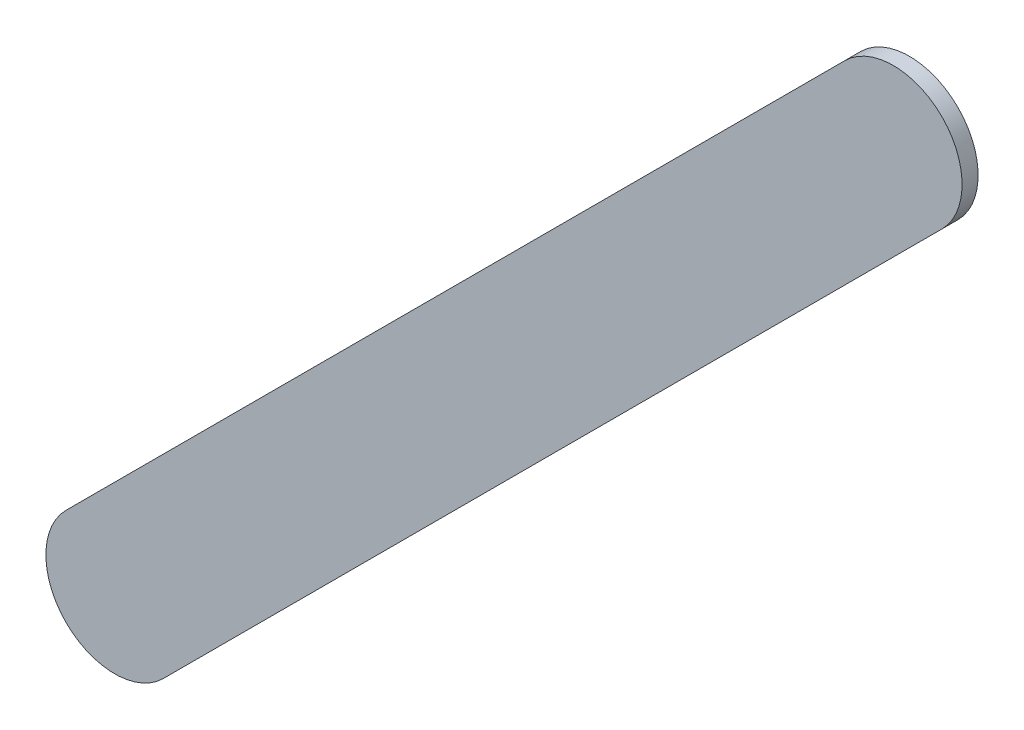
ISO-10303-21;
HEADER;
FILE_DESCRIPTION(('STEP AP214'),'2;1');
FILE_NAME('part.step','',(''),(''),'','','');
FILE_SCHEMA(('AUTOMOTIVE_DESIGN { 1 0 10303 214 1 1 1 1 }'));
ENDSEC;
DATA;
#1=APPLICATION_CONTEXT('core data for automotive mechanical design processes');
#2=APPLICATION_PROTOCOL_DEFINITION('international standard','automotive_design',2000,#1);
#3=PRODUCT_CONTEXT('',#1,'mechanical');
#4=PRODUCT('Part','Part','',(#3));
#5=PRODUCT_RELATED_PRODUCT_CATEGORY('part','',(#4));
#6=PRODUCT_DEFINITION_FORMATION('','',#4);
#7=PRODUCT_DEFINITION_CONTEXT('part definition',#1,'design');
#8=PRODUCT_DEFINITION('design','',#6,#7);
#9=PRODUCT_DEFINITION_SHAPE('','',#8);
#10=(LENGTH_UNIT() NAMED_UNIT(*) SI_UNIT(.MILLI.,.METRE.));
#11=(NAMED_UNIT(*) PLANE_ANGLE_UNIT() SI_UNIT($,.RADIAN.));
#12=(NAMED_UNIT(*) SI_UNIT($,.STERADIAN.) SOLID_ANGLE_UNIT());
#13=UNCERTAINTY_MEASURE_WITH_UNIT(LENGTH_MEASURE(1.E-05),#10,'distance_accuracy_value','');
#14=(GEOMETRIC_REPRESENTATION_CONTEXT(3) GLOBAL_UNCERTAINTY_ASSIGNED_CONTEXT((#13)) GLOBAL_UNIT_ASSIGNED_CONTEXT((#10,
#11,#12)) REPRESENTATION_CONTEXT('',''));
#15=CARTESIAN_POINT('',(0.,0.,0.));
#16=DIRECTION('',(0.,0.,1.));
#17=DIRECTION('',(1.,0.,0.));
#18=AXIS2_PLACEMENT_3D('',#15,#16,#17);
#19=CARTESIAN_POINT('',(77.843933,-91.243933,1.635));
#20=DIRECTION('',(0.,0.,1.));
#21=DIRECTION('',(1.,0.,0.));
#22=AXIS2_PLACEMENT_3D('',#19,#20,#21);
#23=PLANE('',#22);
#24=DIRECTION('',(-0.707106781186548,-0.707106781186548,0.));
#25=VECTOR('',#24,1.);
#26=CARTESIAN_POINT('',(77.843933,-91.243933,1.635));
#27=LINE('',#26,#25);
#28=CARTESIAN_POINT('',(77.843933,-91.243933,1.635));
#29=VERTEX_POINT('',#28);
#30=CARTESIAN_POINT('',(76.143933,-92.943933,1.635));
#31=VERTEX_POINT('',#30);
#32=EDGE_CURVE('E93',#29,#31,#27,.T.);
#33=ORIENTED_EDGE('',*,*,#32,.T.);
#34=CARTESIAN_POINT('',(76.2499995,-93.0499995,1.635));
#35=DIRECTION('',(0.,0.,1.));
#36=DIRECTION('',(-0.707106781186548,0.707106781186548,0.));
#37=AXIS2_PLACEMENT_3D('',#34,#35,#36);
#38=CIRCLE('',#37,0.150000682813);
#39=CARTESIAN_POINT('',(76.356066,-93.156066,1.635));
#40=VERTEX_POINT('',#39);
#41=EDGE_CURVE('E71',#31,#40,#38,.T.);
#42=ORIENTED_EDGE('',*,*,#41,.T.);
#43=DIRECTION('',(0.707106781186548,0.707106781186548,0.));
#44=VECTOR('',#43,1.);
#45=CARTESIAN_POINT('',(76.356066,-93.156066,1.635));
#46=LINE('',#45,#44);
#47=CARTESIAN_POINT('',(78.056066,-91.456066,1.635));
#48=VERTEX_POINT('',#47);
#49=EDGE_CURVE('E76',#40,#48,#46,.T.);
#50=ORIENTED_EDGE('',*,*,#49,.T.);
#51=CARTESIAN_POINT('',(77.9499995,-91.3499995,1.635));
#52=DIRECTION('',(0.,0.,1.));
#53=DIRECTION('',(0.707106781186548,-0.707106781186548,0.));
#54=AXIS2_PLACEMENT_3D('',#51,#52,#53);
#55=CIRCLE('',#54,0.150000682813);
#56=EDGE_CURVE('E11',#48,#29,#55,.T.);
#57=ORIENTED_EDGE('',*,*,#56,.T.);
#58=EDGE_LOOP('',(#33,#42,#50,#57));
#59=FACE_BOUND('',#58,.T.);
#60=ADVANCED_FACE('F17',(#59),#23,.T.);
#61=CARTESIAN_POINT('',(77.843933,-91.243933,1.6));
#62=DIRECTION('',(0.,0.,1.));
#63=DIRECTION('',(1.,0.,0.));
#64=AXIS2_PLACEMENT_3D('',#61,#62,#63);
#65=PLANE('',#64);
#66=CARTESIAN_POINT('',(77.9499995,-91.3499995,1.6));
#67=DIRECTION('',(0.,0.,1.));
#68=DIRECTION('',(0.707106781186548,-0.707106781186548,0.));
#69=AXIS2_PLACEMENT_3D('',#66,#67,#68);
#70=CIRCLE('',#69,0.150000682813);
#71=CARTESIAN_POINT('',(78.056066,-91.456066,1.6));
#72=VERTEX_POINT('',#71);
#73=CARTESIAN_POINT('',(77.843933,-91.243933,1.6));
#74=VERTEX_POINT('',#73);
#75=EDGE_CURVE('E25',#72,#74,#70,.T.);
#76=ORIENTED_EDGE('',*,*,#75,.F.);
#77=DIRECTION('',(0.707106781186548,0.707106781186548,0.));
#78=VECTOR('',#77,1.);
#79=CARTESIAN_POINT('',(76.356066,-93.156066,1.6));
#80=LINE('',#79,#78);
#81=CARTESIAN_POINT('',(76.356066,-93.156066,1.6));
#82=VERTEX_POINT('',#81);
#83=EDGE_CURVE('E60',#82,#72,#80,.T.);
#84=ORIENTED_EDGE('',*,*,#83,.F.);
#85=CARTESIAN_POINT('',(76.2499995,-93.0499995,1.6));
#86=DIRECTION('',(0.,0.,1.));
#87=DIRECTION('',(-0.707106781186548,0.707106781186548,0.));
#88=AXIS2_PLACEMENT_3D('',#85,#86,#87);
#89=CIRCLE('',#88,0.150000682813);
#90=CARTESIAN_POINT('',(76.143933,-92.943933,1.6));
#91=VERTEX_POINT('',#90);
#92=EDGE_CURVE('E65',#91,#82,#89,.T.);
#93=ORIENTED_EDGE('',*,*,#92,.F.);
#94=DIRECTION('',(-0.707106781186548,-0.707106781186548,0.));
#95=VECTOR('',#94,1.);
#96=CARTESIAN_POINT('',(77.843933,-91.243933,1.6));
#97=LINE('',#96,#95);
#98=EDGE_CURVE('E111',#74,#91,#97,.T.);
#99=ORIENTED_EDGE('',*,*,#98,.F.);
#100=EDGE_LOOP('',(#76,#84,#93,#99));
#101=FACE_BOUND('',#100,.T.);
#102=ADVANCED_FACE('F62',(#101),#65,.F.);
#103=CARTESIAN_POINT('',(77.9499995,-91.3499995,1.6));
#104=DIRECTION('',(0.,0.,-1.));
#105=DIRECTION('',(0.707106781186548,-0.707106781186548,0.));
#106=AXIS2_PLACEMENT_3D('',#103,#104,#105);
#107=CYLINDRICAL_SURFACE('',#106,0.150000682813);
#108=ORIENTED_EDGE('',*,*,#75,.T.);
#109=DIRECTION('',(0.,0.,1.));
#110=VECTOR('',#109,1.);
#111=CARTESIAN_POINT('',(77.843933,-91.243933,1.6));
#112=LINE('',#111,#110);
#113=EDGE_CURVE('E87',#74,#29,#112,.T.);
#114=ORIENTED_EDGE('',*,*,#113,.T.);
#115=ORIENTED_EDGE('',*,*,#56,.F.);
#116=DIRECTION('',(0.,0.,1.));
#117=VECTOR('',#116,1.);
#118=CARTESIAN_POINT('',(78.056066,-91.456066,1.6));
#119=LINE('',#118,#117);
#120=EDGE_CURVE('E70',#72,#48,#119,.T.);
#121=ORIENTED_EDGE('',*,*,#120,.F.);
#122=EDGE_LOOP('',(#108,#114,#115,#121));
#123=FACE_BOUND('',#122,.T.);
#124=ADVANCED_FACE('F105',(#123),#107,.T.);
#125=CARTESIAN_POINT('',(76.356066,-93.156066,1.6));
#126=DIRECTION('',(-0.707106781186548,0.707106781186548,0.));
#127=DIRECTION('',(0.,0.,1.));
#128=AXIS2_PLACEMENT_3D('',#125,#126,#127);
#129=PLANE('',#128);
#130=ORIENTED_EDGE('',*,*,#83,.T.);
#131=ORIENTED_EDGE('',*,*,#120,.T.);
#132=ORIENTED_EDGE('',*,*,#49,.F.);
#133=DIRECTION('',(0.,0.,1.));
#134=VECTOR('',#133,1.);
#135=CARTESIAN_POINT('',(76.356066,-93.156066,1.6));
#136=LINE('',#135,#134);
#137=EDGE_CURVE('E74',#82,#40,#136,.T.);
#138=ORIENTED_EDGE('',*,*,#137,.F.);
#139=EDGE_LOOP('',(#130,#131,#132,#138));
#140=FACE_BOUND('',#139,.T.);
#141=ADVANCED_FACE('F75',(#140),#129,.F.);
#142=CARTESIAN_POINT('',(76.2499995,-93.0499995,1.6));
#143=DIRECTION('',(0.,0.,-1.));
#144=DIRECTION('',(-0.707106781186548,0.707106781186548,0.));
#145=AXIS2_PLACEMENT_3D('',#142,#143,#144);
#146=CYLINDRICAL_SURFACE('',#145,0.150000682813);
#147=ORIENTED_EDGE('',*,*,#92,.T.);
#148=ORIENTED_EDGE('',*,*,#137,.T.);
#149=ORIENTED_EDGE('',*,*,#41,.F.);
#150=DIRECTION('',(0.,0.,1.));
#151=VECTOR('',#150,1.);
#152=CARTESIAN_POINT('',(76.143933,-92.943933,1.6));
#153=LINE('',#152,#151);
#154=EDGE_CURVE('E84',#91,#31,#153,.T.);
#155=ORIENTED_EDGE('',*,*,#154,.F.);
#156=EDGE_LOOP('',(#147,#148,#149,#155));
#157=FACE_BOUND('',#156,.T.);
#158=ADVANCED_FACE('F82',(#157),#146,.T.);
#159=CARTESIAN_POINT('',(77.843933,-91.243933,1.6));
#160=DIRECTION('',(0.707106781186548,-0.707106781186548,0.));
#161=DIRECTION('',(0.,0.,-1.));
#162=AXIS2_PLACEMENT_3D('',#159,#160,#161);
#163=PLANE('',#162);
#164=ORIENTED_EDGE('',*,*,#98,.T.);
#165=ORIENTED_EDGE('',*,*,#154,.T.);
#166=ORIENTED_EDGE('',*,*,#32,.F.);
#167=ORIENTED_EDGE('',*,*,#113,.F.);
#168=EDGE_LOOP('',(#164,#165,#166,#167));
#169=FACE_BOUND('',#168,.T.);
#170=ADVANCED_FACE('F110',(#169),#163,.F.);
#171=CLOSED_SHELL('',(#60,#102,#124,#141,#158,#170));
#172=MANIFOLD_SOLID_BREP('B1',#171);
#173=ADVANCED_BREP_SHAPE_REPRESENTATION('',(#18,#172),#14);
#174=SHAPE_DEFINITION_REPRESENTATION(#9,#173);
ENDSEC;
END-ISO-10303-21;
